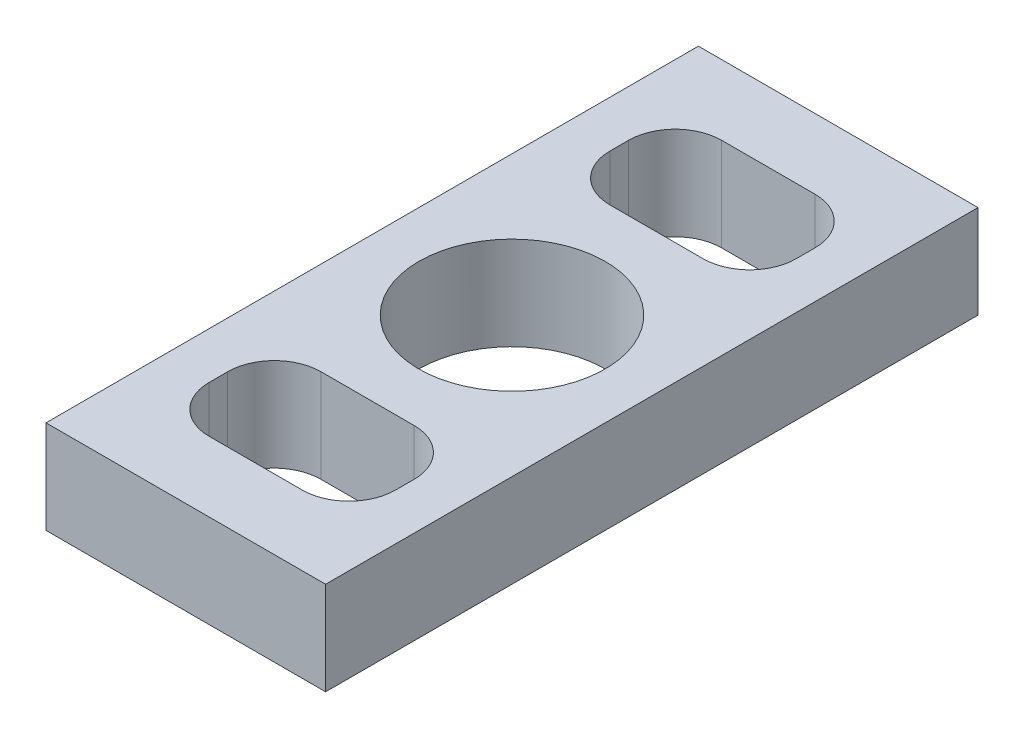
ISO-10303-21;
HEADER;
FILE_DESCRIPTION(('STEP AP214'),'2;1');
FILE_NAME('part.step','',(''),(''),'','','');
FILE_SCHEMA(('AUTOMOTIVE_DESIGN { 1 0 10303 214 1 1 1 1 }'));
ENDSEC;
DATA;
#1=APPLICATION_CONTEXT('core data for automotive mechanical design processes');
#2=APPLICATION_PROTOCOL_DEFINITION('international standard','automotive_design',2000,#1);
#3=PRODUCT_CONTEXT('',#1,'mechanical');
#4=PRODUCT('Part','Part','',(#3));
#5=PRODUCT_RELATED_PRODUCT_CATEGORY('part','',(#4));
#6=PRODUCT_DEFINITION_FORMATION('','',#4);
#7=PRODUCT_DEFINITION_CONTEXT('part definition',#1,'design');
#8=PRODUCT_DEFINITION('design','',#6,#7);
#9=PRODUCT_DEFINITION_SHAPE('','',#8);
#10=(LENGTH_UNIT() NAMED_UNIT(*) SI_UNIT(.MILLI.,.METRE.));
#11=(NAMED_UNIT(*) PLANE_ANGLE_UNIT() SI_UNIT($,.RADIAN.));
#12=(NAMED_UNIT(*) SI_UNIT($,.STERADIAN.) SOLID_ANGLE_UNIT());
#13=UNCERTAINTY_MEASURE_WITH_UNIT(LENGTH_MEASURE(1.E-05),#10,'distance_accuracy_value','');
#14=(GEOMETRIC_REPRESENTATION_CONTEXT(3) GLOBAL_UNCERTAINTY_ASSIGNED_CONTEXT((#13)) GLOBAL_UNIT_ASSIGNED_CONTEXT((#10,
#11,#12)) REPRESENTATION_CONTEXT('',''));
#15=CARTESIAN_POINT('',(0.,0.,0.));
#16=DIRECTION('',(0.,0.,1.));
#17=DIRECTION('',(1.,0.,0.));
#18=AXIS2_PLACEMENT_3D('',#15,#16,#17);
#19=CARTESIAN_POINT('',(-24.7431034482759,6.13103448275861,88.9));
#20=DIRECTION('',(1.,0.,0.));
#21=DIRECTION('',(0.,0.,-1.));
#22=AXIS2_PLACEMENT_3D('',#19,#20,#21);
#23=PLANE('',#22);
#24=DIRECTION('',(0.,-1.,0.));
#25=VECTOR('',#24,1.);
#26=CARTESIAN_POINT('',(-24.7431034482759,6.13103448275861,0.));
#27=LINE('',#26,#25);
#28=CARTESIAN_POINT('',(-24.7431034482759,6.13103448275861,0.));
#29=VERTEX_POINT('',#28);
#30=CARTESIAN_POINT('',(-24.7431034482759,-6.56896551724139,0.));
#31=VERTEX_POINT('',#30);
#32=EDGE_CURVE('E201',#29,#31,#27,.T.);
#33=ORIENTED_EDGE('',*,*,#32,.T.);
#34=DIRECTION('',(0.,0.,-1.));
#35=VECTOR('',#34,1.);
#36=CARTESIAN_POINT('',(-24.7431034482759,-6.56896551724139,88.9));
#37=LINE('',#36,#35);
#38=CARTESIAN_POINT('',(-24.7431034482759,-6.56896551724139,88.9));
#39=VERTEX_POINT('',#38);
#40=EDGE_CURVE('E180',#39,#31,#37,.T.);
#41=ORIENTED_EDGE('',*,*,#40,.F.);
#42=DIRECTION('',(0.,-1.,0.));
#43=VECTOR('',#42,1.);
#44=CARTESIAN_POINT('',(-24.7431034482759,6.13103448275861,88.9));
#45=LINE('',#44,#43);
#46=CARTESIAN_POINT('',(-24.7431034482759,6.13103448275861,88.9));
#47=VERTEX_POINT('',#46);
#48=EDGE_CURVE('E188',#47,#39,#45,.T.);
#49=ORIENTED_EDGE('',*,*,#48,.F.);
#50=DIRECTION('',(0.,0.,-1.));
#51=VECTOR('',#50,1.);
#52=CARTESIAN_POINT('',(-24.7431034482759,6.13103448275861,88.9));
#53=LINE('',#52,#51);
#54=EDGE_CURVE('E368',#47,#29,#53,.T.);
#55=ORIENTED_EDGE('',*,*,#54,.T.);
#56=EDGE_LOOP('',(#33,#41,#49,#55));
#57=FACE_BOUND('',#56,.T.);
#58=ADVANCED_FACE('F38',(#57),#23,.F.);
#59=CARTESIAN_POINT('',(-24.7431034482759,-6.56896551724139,88.9));
#60=DIRECTION('',(0.,1.,0.));
#61=DIRECTION('',(0.,0.,1.));
#62=AXIS2_PLACEMENT_3D('',#59,#60,#61);
#63=PLANE('',#62);
#64=DIRECTION('',(0.,0.,-1.));
#65=VECTOR('',#64,1.);
#66=CARTESIAN_POINT('',(7.00689655172414,-6.56896551724139,9.525));
#67=LINE('',#66,#65);
#68=CARTESIAN_POINT('',(7.00689655172414,-6.56896551724139,18.415));
#69=VERTEX_POINT('',#68);
#70=CARTESIAN_POINT('',(7.00689655172414,-6.56896551724139,15.875));
#71=VERTEX_POINT('',#70);
#72=EDGE_CURVE('E598',#69,#71,#67,.T.);
#73=ORIENTED_EDGE('',*,*,#72,.T.);
#74=CARTESIAN_POINT('',(0.656896551724143,-6.56896551724139,15.875));
#75=DIRECTION('',(0.,1.,0.));
#76=DIRECTION('',(0.,0.,1.));
#77=AXIS2_PLACEMENT_3D('',#74,#75,#76);
#78=CIRCLE('',#77,6.35);
#79=CARTESIAN_POINT('',(0.656896551724143,-6.56896551724139,9.525));
#80=VERTEX_POINT('',#79);
#81=EDGE_CURVE('E285',#71,#80,#78,.T.);
#82=ORIENTED_EDGE('',*,*,#81,.T.);
#83=DIRECTION('',(-1.,0.,0.));
#84=VECTOR('',#83,1.);
#85=CARTESIAN_POINT('',(-18.3931034482759,-6.56896551724139,9.525));
#86=LINE('',#85,#84);
#87=CARTESIAN_POINT('',(-12.0431034482759,-6.56896551724139,9.525));
#88=VERTEX_POINT('',#87);
#89=EDGE_CURVE('E360',#80,#88,#86,.T.);
#90=ORIENTED_EDGE('',*,*,#89,.T.);
#91=CARTESIAN_POINT('',(-12.0431034482759,-6.56896551724139,15.875));
#92=DIRECTION('',(0.,1.,0.));
#93=DIRECTION('',(0.,0.,1.));
#94=AXIS2_PLACEMENT_3D('',#91,#92,#93);
#95=CIRCLE('',#94,6.35);
#96=CARTESIAN_POINT('',(-18.3931034482759,-6.56896551724139,15.875));
#97=VERTEX_POINT('',#96);
#98=EDGE_CURVE('E279',#88,#97,#95,.T.);
#99=ORIENTED_EDGE('',*,*,#98,.T.);
#100=DIRECTION('',(0.,0.,1.));
#101=VECTOR('',#100,1.);
#102=CARTESIAN_POINT('',(-18.3931034482759,-6.56896551724139,9.525));
#103=LINE('',#102,#101);
#104=CARTESIAN_POINT('',(-18.3931034482759,-6.56896551724139,18.415));
#105=VERTEX_POINT('',#104);
#106=EDGE_CURVE('E610',#97,#105,#103,.T.);
#107=ORIENTED_EDGE('',*,*,#106,.T.);
#108=CARTESIAN_POINT('',(-12.0431034482759,-6.56896551724139,18.415));
#109=DIRECTION('',(0.,1.,0.));
#110=DIRECTION('',(0.,0.,1.));
#111=AXIS2_PLACEMENT_3D('',#108,#109,#110);
#112=CIRCLE('',#111,6.35);
#113=CARTESIAN_POINT('',(-12.0431034482759,-6.56896551724139,24.765));
#114=VERTEX_POINT('',#113);
#115=EDGE_CURVE('E273',#105,#114,#112,.T.);
#116=ORIENTED_EDGE('',*,*,#115,.T.);
#117=DIRECTION('',(1.,0.,0.));
#118=VECTOR('',#117,1.);
#119=CARTESIAN_POINT('',(-18.3931034482759,-6.56896551724139,24.765));
#120=LINE('',#119,#118);
#121=CARTESIAN_POINT('',(0.656896551724146,-6.56896551724139,24.765));
#122=VERTEX_POINT('',#121);
#123=EDGE_CURVE('E600',#114,#122,#120,.T.);
#124=ORIENTED_EDGE('',*,*,#123,.T.);
#125=CARTESIAN_POINT('',(0.656896551724145,-6.56896551724139,18.415));
#126=DIRECTION('',(0.,1.,0.));
#127=DIRECTION('',(0.,0.,1.));
#128=AXIS2_PLACEMENT_3D('',#125,#126,#127);
#129=CIRCLE('',#128,6.35);
#130=EDGE_CURVE('E267',#122,#69,#129,.T.);
#131=ORIENTED_EDGE('',*,*,#130,.T.);
#132=EDGE_LOOP('',(#73,#82,#90,#99,#107,#116,#124,#131));
#133=FACE_BOUND('',#132,.T.);
#134=DIRECTION('',(0.,0.,-1.));
#135=VECTOR('',#134,1.);
#136=CARTESIAN_POINT('',(7.00689655172415,-6.56896551724139,79.375));
#137=LINE('',#136,#135);
#138=CARTESIAN_POINT('',(7.00689655172415,-6.56896551724139,73.025));
#139=VERTEX_POINT('',#138);
#140=CARTESIAN_POINT('',(7.00689655172415,-6.56896551724139,70.485));
#141=VERTEX_POINT('',#140);
#142=EDGE_CURVE('E333',#139,#141,#137,.T.);
#143=ORIENTED_EDGE('',*,*,#142,.T.);
#144=CARTESIAN_POINT('',(0.65689655172415,-6.56896551724139,70.485));
#145=DIRECTION('',(0.,1.,0.));
#146=DIRECTION('',(0.,0.,1.));
#147=AXIS2_PLACEMENT_3D('',#144,#145,#146);
#148=CIRCLE('',#147,6.35);
#149=CARTESIAN_POINT('',(0.65689655172415,-6.56896551724139,64.135));
#150=VERTEX_POINT('',#149);
#151=EDGE_CURVE('E291',#141,#150,#148,.T.);
#152=ORIENTED_EDGE('',*,*,#151,.T.);
#153=DIRECTION('',(-1.,0.,0.));
#154=VECTOR('',#153,1.);
#155=CARTESIAN_POINT('',(-18.3931034482759,-6.56896551724139,64.135));
#156=LINE('',#155,#154);
#157=CARTESIAN_POINT('',(-12.0431034482759,-6.56896551724139,64.135));
#158=VERTEX_POINT('',#157);
#159=EDGE_CURVE('E342',#150,#158,#156,.T.);
#160=ORIENTED_EDGE('',*,*,#159,.T.);
#161=CARTESIAN_POINT('',(-12.0431034482759,-6.56896551724139,70.485));
#162=DIRECTION('',(0.,1.,0.));
#163=DIRECTION('',(0.,0.,1.));
#164=AXIS2_PLACEMENT_3D('',#161,#162,#163);
#165=CIRCLE('',#164,6.35);
#166=CARTESIAN_POINT('',(-18.3931034482759,-6.56896551724139,70.485));
#167=VERTEX_POINT('',#166);
#168=EDGE_CURVE('E11',#158,#167,#165,.T.);
#169=ORIENTED_EDGE('',*,*,#168,.T.);
#170=DIRECTION('',(0.,0.,1.));
#171=VECTOR('',#170,1.);
#172=CARTESIAN_POINT('',(-18.3931034482759,-6.56896551724139,79.375));
#173=LINE('',#172,#171);
#174=CARTESIAN_POINT('',(-18.3931034482759,-6.56896551724139,73.025));
#175=VERTEX_POINT('',#174);
#176=EDGE_CURVE('E323',#167,#175,#173,.T.);
#177=ORIENTED_EDGE('',*,*,#176,.T.);
#178=CARTESIAN_POINT('',(-12.0431034482759,-6.56896551724139,73.025));
#179=DIRECTION('',(0.,1.,0.));
#180=DIRECTION('',(0.,0.,1.));
#181=AXIS2_PLACEMENT_3D('',#178,#179,#180);
#182=CIRCLE('',#181,6.35);
#183=CARTESIAN_POINT('',(-12.0431034482759,-6.56896551724139,79.375));
#184=VERTEX_POINT('',#183);
#185=EDGE_CURVE('E303',#175,#184,#182,.T.);
#186=ORIENTED_EDGE('',*,*,#185,.T.);
#187=DIRECTION('',(1.,0.,0.));
#188=VECTOR('',#187,1.);
#189=CARTESIAN_POINT('',(-18.3931034482759,-6.56896551724139,79.375));
#190=LINE('',#189,#188);
#191=CARTESIAN_POINT('',(0.656896551724153,-6.56896551724139,79.375));
#192=VERTEX_POINT('',#191);
#193=EDGE_CURVE('E329',#184,#192,#190,.T.);
#194=ORIENTED_EDGE('',*,*,#193,.T.);
#195=CARTESIAN_POINT('',(0.656896551724152,-6.56896551724139,73.025));
#196=DIRECTION('',(0.,1.,0.));
#197=DIRECTION('',(0.,0.,1.));
#198=AXIS2_PLACEMENT_3D('',#195,#196,#197);
#199=CIRCLE('',#198,6.35);
#200=EDGE_CURVE('E297',#192,#139,#199,.T.);
#201=ORIENTED_EDGE('',*,*,#200,.T.);
#202=EDGE_LOOP('',(#143,#152,#160,#169,#177,#186,#194,#201));
#203=FACE_BOUND('',#202,.T.);
#204=CARTESIAN_POINT('',(-5.69310344827585,-6.56896551724138,44.45));
#205=DIRECTION('',(0.,1.,0.));
#206=DIRECTION('',(0.,0.,1.));
#207=AXIS2_PLACEMENT_3D('',#204,#205,#206);
#208=CIRCLE('',#207,12.7);
#209=CARTESIAN_POINT('',(-5.69310344827585,-6.56896551724138,57.15));
#210=VERTEX_POINT('',#209);
#211=EDGE_CURVE('E359',#210,#210,#208,.T.);
#212=ORIENTED_EDGE('',*,*,#211,.T.);
#213=EDGE_LOOP('',(#212));
#214=FACE_BOUND('',#213,.T.);
#215=DIRECTION('',(1.,0.,0.));
#216=VECTOR('',#215,1.);
#217=CARTESIAN_POINT('',(-24.7431034482759,-6.56896551724139,0.));
#218=LINE('',#217,#216);
#219=CARTESIAN_POINT('',(13.3568965517241,-6.56896551724139,0.));
#220=VERTEX_POINT('',#219);
#221=EDGE_CURVE('E371',#31,#220,#218,.T.);
#222=ORIENTED_EDGE('',*,*,#221,.T.);
#223=DIRECTION('',(0.,0.,-1.));
#224=VECTOR('',#223,1.);
#225=CARTESIAN_POINT('',(13.3568965517241,-6.56896551724139,88.9));
#226=LINE('',#225,#224);
#227=CARTESIAN_POINT('',(13.3568965517241,-6.56896551724139,88.9));
#228=VERTEX_POINT('',#227);
#229=EDGE_CURVE('E183',#228,#220,#226,.T.);
#230=ORIENTED_EDGE('',*,*,#229,.F.);
#231=DIRECTION('',(1.,0.,0.));
#232=VECTOR('',#231,1.);
#233=CARTESIAN_POINT('',(-24.7431034482759,-6.56896551724139,88.9));
#234=LINE('',#233,#232);
#235=EDGE_CURVE('E176',#39,#228,#234,.T.);
#236=ORIENTED_EDGE('',*,*,#235,.F.);
#237=ORIENTED_EDGE('',*,*,#40,.T.);
#238=EDGE_LOOP('',(#222,#230,#236,#237));
#239=FACE_BOUND('',#238,.T.);
#240=ADVANCED_FACE('F178',(#133,#203,#214,#239),#63,.F.);
#241=CARTESIAN_POINT('',(13.3568965517241,6.13103448275861,88.9));
#242=DIRECTION('',(-1.,0.,0.));
#243=DIRECTION('',(0.,0.,1.));
#244=AXIS2_PLACEMENT_3D('',#241,#242,#243);
#245=PLANE('',#244);
#246=DIRECTION('',(0.,1.,0.));
#247=VECTOR('',#246,1.);
#248=CARTESIAN_POINT('',(13.3568965517241,6.13103448275861,0.));
#249=LINE('',#248,#247);
#250=CARTESIAN_POINT('',(13.3568965517241,6.13103448275861,0.));
#251=VERTEX_POINT('',#250);
#252=EDGE_CURVE('E374',#220,#251,#249,.T.);
#253=ORIENTED_EDGE('',*,*,#252,.T.);
#254=DIRECTION('',(0.,0.,-1.));
#255=VECTOR('',#254,1.);
#256=CARTESIAN_POINT('',(13.3568965517241,6.13103448275861,88.9));
#257=LINE('',#256,#255);
#258=CARTESIAN_POINT('',(13.3568965517241,6.13103448275861,88.9));
#259=VERTEX_POINT('',#258);
#260=EDGE_CURVE('E209',#259,#251,#257,.T.);
#261=ORIENTED_EDGE('',*,*,#260,.F.);
#262=DIRECTION('',(0.,1.,0.));
#263=VECTOR('',#262,1.);
#264=CARTESIAN_POINT('',(13.3568965517241,6.13103448275861,88.9));
#265=LINE('',#264,#263);
#266=EDGE_CURVE('E187',#228,#259,#265,.T.);
#267=ORIENTED_EDGE('',*,*,#266,.F.);
#268=ORIENTED_EDGE('',*,*,#229,.T.);
#269=EDGE_LOOP('',(#253,#261,#267,#268));
#270=FACE_BOUND('',#269,.T.);
#271=ADVANCED_FACE('F389',(#270),#245,.F.);
#272=CARTESIAN_POINT('',(-24.7431034482759,6.13103448275861,88.9));
#273=DIRECTION('',(0.,-1.,0.));
#274=DIRECTION('',(1.,0.,0.));
#275=AXIS2_PLACEMENT_3D('',#272,#273,#274);
#276=PLANE('',#275);
#277=DIRECTION('',(1.,0.,0.));
#278=VECTOR('',#277,1.);
#279=CARTESIAN_POINT('',(-18.3931034482759,6.13103448275861,24.765));
#280=LINE('',#279,#278);
#281=CARTESIAN_POINT('',(-12.0431034482759,6.13103448275861,24.765));
#282=VERTEX_POINT('',#281);
#283=CARTESIAN_POINT('',(0.656896551724146,6.13103448275861,24.765));
#284=VERTEX_POINT('',#283);
#285=EDGE_CURVE('E586',#282,#284,#280,.T.);
#286=ORIENTED_EDGE('',*,*,#285,.F.);
#287=CARTESIAN_POINT('',(-12.0431034482759,6.13103448275861,18.415));
#288=DIRECTION('',(0.,-1.,0.));
#289=DIRECTION('',(1.,0.,0.));
#290=AXIS2_PLACEMENT_3D('',#287,#288,#289);
#291=CIRCLE('',#290,6.35);
#292=CARTESIAN_POINT('',(-18.3931034482759,6.13103448275861,18.415));
#293=VERTEX_POINT('',#292);
#294=EDGE_CURVE('E270',#282,#293,#291,.T.);
#295=ORIENTED_EDGE('',*,*,#294,.T.);
#296=DIRECTION('',(0.,0.,1.));
#297=VECTOR('',#296,1.);
#298=CARTESIAN_POINT('',(-18.3931034482759,6.13103448275861,9.525));
#299=LINE('',#298,#297);
#300=CARTESIAN_POINT('',(-18.3931034482759,6.13103448275861,15.875));
#301=VERTEX_POINT('',#300);
#302=EDGE_CURVE('E345',#301,#293,#299,.T.);
#303=ORIENTED_EDGE('',*,*,#302,.F.);
#304=CARTESIAN_POINT('',(-12.0431034482759,6.13103448275861,15.875));
#305=DIRECTION('',(0.,-1.,0.));
#306=DIRECTION('',(1.,0.,0.));
#307=AXIS2_PLACEMENT_3D('',#304,#305,#306);
#308=CIRCLE('',#307,6.35);
#309=CARTESIAN_POINT('',(-12.0431034482759,6.13103448275861,9.525));
#310=VERTEX_POINT('',#309);
#311=EDGE_CURVE('E276',#301,#310,#308,.T.);
#312=ORIENTED_EDGE('',*,*,#311,.T.);
#313=DIRECTION('',(-1.,0.,0.));
#314=VECTOR('',#313,1.);
#315=CARTESIAN_POINT('',(-18.3931034482759,6.13103448275861,9.525));
#316=LINE('',#315,#314);
#317=CARTESIAN_POINT('',(0.656896551724143,6.13103448275861,9.525));
#318=VERTEX_POINT('',#317);
#319=EDGE_CURVE('E336',#318,#310,#316,.T.);
#320=ORIENTED_EDGE('',*,*,#319,.F.);
#321=CARTESIAN_POINT('',(0.656896551724143,6.13103448275861,15.875));
#322=DIRECTION('',(0.,-1.,0.));
#323=DIRECTION('',(1.,0.,0.));
#324=AXIS2_PLACEMENT_3D('',#321,#322,#323);
#325=CIRCLE('',#324,6.35);
#326=CARTESIAN_POINT('',(7.00689655172414,6.13103448275861,15.875));
#327=VERTEX_POINT('',#326);
#328=EDGE_CURVE('E282',#318,#327,#325,.T.);
#329=ORIENTED_EDGE('',*,*,#328,.T.);
#330=DIRECTION('',(0.,0.,-1.));
#331=VECTOR('',#330,1.);
#332=CARTESIAN_POINT('',(7.00689655172414,6.13103448275861,9.525));
#333=LINE('',#332,#331);
#334=CARTESIAN_POINT('',(7.00689655172414,6.13103448275861,18.415));
#335=VERTEX_POINT('',#334);
#336=EDGE_CURVE('E592',#335,#327,#333,.T.);
#337=ORIENTED_EDGE('',*,*,#336,.F.);
#338=CARTESIAN_POINT('',(0.656896551724146,6.13103448275861,18.415));
#339=DIRECTION('',(0.,-1.,0.));
#340=DIRECTION('',(1.,0.,0.));
#341=AXIS2_PLACEMENT_3D('',#338,#339,#340);
#342=CIRCLE('',#341,6.35);
#343=EDGE_CURVE('E264',#335,#284,#342,.T.);
#344=ORIENTED_EDGE('',*,*,#343,.T.);
#345=EDGE_LOOP('',(#286,#295,#303,#312,#320,#329,#337,#344));
#346=FACE_BOUND('',#345,.T.);
#347=DIRECTION('',(1.,0.,0.));
#348=VECTOR('',#347,1.);
#349=CARTESIAN_POINT('',(-18.3931034482759,6.13103448275861,79.375));
#350=LINE('',#349,#348);
#351=CARTESIAN_POINT('',(-12.0431034482759,6.13103448275861,79.375));
#352=VERTEX_POINT('',#351);
#353=CARTESIAN_POINT('',(0.656896551724153,6.13103448275861,79.375));
#354=VERTEX_POINT('',#353);
#355=EDGE_CURVE('E348',#352,#354,#350,.T.);
#356=ORIENTED_EDGE('',*,*,#355,.F.);
#357=CARTESIAN_POINT('',(-12.0431034482759,6.13103448275861,73.025));
#358=DIRECTION('',(0.,-1.,0.));
#359=DIRECTION('',(1.,0.,0.));
#360=AXIS2_PLACEMENT_3D('',#357,#358,#359);
#361=CIRCLE('',#360,6.35);
#362=CARTESIAN_POINT('',(-18.3931034482759,6.13103448275861,73.025));
#363=VERTEX_POINT('',#362);
#364=EDGE_CURVE('E300',#352,#363,#361,.T.);
#365=ORIENTED_EDGE('',*,*,#364,.T.);
#366=DIRECTION('',(0.,0.,1.));
#367=VECTOR('',#366,1.);
#368=CARTESIAN_POINT('',(-18.3931034482759,6.13103448275861,79.375));
#369=LINE('',#368,#367);
#370=CARTESIAN_POINT('',(-18.3931034482759,6.13103448275861,70.485));
#371=VERTEX_POINT('',#370);
#372=EDGE_CURVE('E314',#371,#363,#369,.T.);
#373=ORIENTED_EDGE('',*,*,#372,.F.);
#374=CARTESIAN_POINT('',(-12.0431034482759,6.13103448275861,70.485));
#375=DIRECTION('',(0.,-1.,0.));
#376=DIRECTION('',(1.,0.,0.));
#377=AXIS2_PLACEMENT_3D('',#374,#375,#376);
#378=CIRCLE('',#377,6.35);
#379=CARTESIAN_POINT('',(-12.0431034482759,6.13103448275861,64.135));
#380=VERTEX_POINT('',#379);
#381=EDGE_CURVE('E47',#371,#380,#378,.T.);
#382=ORIENTED_EDGE('',*,*,#381,.T.);
#383=DIRECTION('',(-1.,0.,0.));
#384=VECTOR('',#383,1.);
#385=CARTESIAN_POINT('',(-18.3931034482759,6.13103448275861,64.135));
#386=LINE('',#385,#384);
#387=CARTESIAN_POINT('',(0.65689655172415,6.13103448275861,64.135));
#388=VERTEX_POINT('',#387);
#389=EDGE_CURVE('E313',#388,#380,#386,.T.);
#390=ORIENTED_EDGE('',*,*,#389,.F.);
#391=CARTESIAN_POINT('',(0.65689655172415,6.13103448275861,70.485));
#392=DIRECTION('',(0.,-1.,0.));
#393=DIRECTION('',(1.,0.,0.));
#394=AXIS2_PLACEMENT_3D('',#391,#392,#393);
#395=CIRCLE('',#394,6.35);
#396=CARTESIAN_POINT('',(7.00689655172415,6.13103448275861,70.485));
#397=VERTEX_POINT('',#396);
#398=EDGE_CURVE('E288',#388,#397,#395,.T.);
#399=ORIENTED_EDGE('',*,*,#398,.T.);
#400=DIRECTION('',(0.,0.,-1.));
#401=VECTOR('',#400,1.);
#402=CARTESIAN_POINT('',(7.00689655172415,6.13103448275861,79.375));
#403=LINE('',#402,#401);
#404=CARTESIAN_POINT('',(7.00689655172415,6.13103448275861,73.025));
#405=VERTEX_POINT('',#404);
#406=EDGE_CURVE('E324',#405,#397,#403,.T.);
#407=ORIENTED_EDGE('',*,*,#406,.F.);
#408=CARTESIAN_POINT('',(0.656896551724152,6.13103448275861,73.025));
#409=DIRECTION('',(0.,-1.,0.));
#410=DIRECTION('',(1.,0.,0.));
#411=AXIS2_PLACEMENT_3D('',#408,#409,#410);
#412=CIRCLE('',#411,6.35);
#413=EDGE_CURVE('E294',#405,#354,#412,.T.);
#414=ORIENTED_EDGE('',*,*,#413,.T.);
#415=EDGE_LOOP('',(#356,#365,#373,#382,#390,#399,#407,#414));
#416=FACE_BOUND('',#415,.T.);
#417=CARTESIAN_POINT('',(-5.69310344827585,6.13103448275861,44.45));
#418=DIRECTION('',(0.,1.,0.));
#419=DIRECTION('',(-1.,0.,0.));
#420=AXIS2_PLACEMENT_3D('',#417,#418,#419);
#421=CIRCLE('',#420,12.7);
#422=CARTESIAN_POINT('',(-18.3931034482759,6.13103448275861,44.45));
#423=VERTEX_POINT('',#422);
#424=EDGE_CURVE('E355',#423,#423,#421,.T.);
#425=ORIENTED_EDGE('',*,*,#424,.F.);
#426=EDGE_LOOP('',(#425));
#427=FACE_BOUND('',#426,.T.);
#428=DIRECTION('',(-1.,0.,0.));
#429=VECTOR('',#428,1.);
#430=CARTESIAN_POINT('',(-24.7431034482759,6.13103448275861,0.));
#431=LINE('',#430,#429);
#432=EDGE_CURVE('E198',#251,#29,#431,.T.);
#433=ORIENTED_EDGE('',*,*,#432,.T.);
#434=ORIENTED_EDGE('',*,*,#54,.F.);
#435=DIRECTION('',(-1.,0.,0.));
#436=VECTOR('',#435,1.);
#437=CARTESIAN_POINT('',(-24.7431034482759,6.13103448275861,88.9));
#438=LINE('',#437,#436);
#439=EDGE_CURVE('E193',#259,#47,#438,.T.);
#440=ORIENTED_EDGE('',*,*,#439,.F.);
#441=ORIENTED_EDGE('',*,*,#260,.T.);
#442=EDGE_LOOP('',(#433,#434,#440,#441));
#443=FACE_BOUND('',#442,.T.);
#444=ADVANCED_FACE('F311',(#346,#416,#427,#443),#276,.F.);
#445=CARTESIAN_POINT('',(0.,0.,88.9));
#446=DIRECTION('',(0.,0.,1.));
#447=DIRECTION('',(1.,0.,0.));
#448=AXIS2_PLACEMENT_3D('',#445,#446,#447);
#449=PLANE('',#448);
#450=ORIENTED_EDGE('',*,*,#48,.T.);
#451=ORIENTED_EDGE('',*,*,#235,.T.);
#452=ORIENTED_EDGE('',*,*,#266,.T.);
#453=ORIENTED_EDGE('',*,*,#439,.T.);
#454=EDGE_LOOP('',(#450,#451,#452,#453));
#455=FACE_BOUND('',#454,.T.);
#456=ADVANCED_FACE('F191',(#455),#449,.T.);
#457=CARTESIAN_POINT('',(0.,0.,0.));
#458=DIRECTION('',(0.,0.,1.));
#459=DIRECTION('',(1.,0.,0.));
#460=AXIS2_PLACEMENT_3D('',#457,#458,#459);
#461=PLANE('',#460);
#462=ORIENTED_EDGE('',*,*,#32,.F.);
#463=ORIENTED_EDGE('',*,*,#432,.F.);
#464=ORIENTED_EDGE('',*,*,#252,.F.);
#465=ORIENTED_EDGE('',*,*,#221,.F.);
#466=EDGE_LOOP('',(#462,#463,#464,#465));
#467=FACE_BOUND('',#466,.T.);
#468=ADVANCED_FACE('F388',(#467),#461,.F.);
#469=CARTESIAN_POINT('',(-5.69310344827586,-82.7689655172414,44.45));
#470=DIRECTION('',(0.,1.,0.));
#471=DIRECTION('',(-1.,0.,0.));
#472=AXIS2_PLACEMENT_3D('',#469,#470,#471);
#473=CYLINDRICAL_SURFACE('',#472,12.7);
#474=ORIENTED_EDGE('',*,*,#424,.T.);
#475=EDGE_LOOP('',(#474));
#476=FACE_BOUND('',#475,.T.);
#477=ORIENTED_EDGE('',*,*,#211,.F.);
#478=EDGE_LOOP('',(#477));
#479=FACE_BOUND('',#478,.T.);
#480=ADVANCED_FACE('F462',(#476,#479),#473,.F.);
#481=CARTESIAN_POINT('',(-18.3931034482759,-6.56896551724139,79.375));
#482=DIRECTION('',(-1.,0.,0.));
#483=DIRECTION('',(0.,-1.,0.));
#484=AXIS2_PLACEMENT_3D('',#481,#482,#483);
#485=PLANE('',#484);
#486=ORIENTED_EDGE('',*,*,#372,.T.);
#487=DIRECTION('',(0.,1.,0.));
#488=VECTOR('',#487,1.);
#489=CARTESIAN_POINT('',(-18.3931034482759,-6.56896551724139,73.025));
#490=LINE('',#489,#488);
#491=EDGE_CURVE('E54',#363,#175,#490,.F.);
#492=ORIENTED_EDGE('',*,*,#491,.T.);
#493=ORIENTED_EDGE('',*,*,#176,.F.);
#494=DIRECTION('',(0.,1.,0.));
#495=VECTOR('',#494,1.);
#496=CARTESIAN_POINT('',(-18.3931034482759,6.13103448275861,70.485));
#497=LINE('',#496,#495);
#498=EDGE_CURVE('E258',#167,#371,#497,.T.);
#499=ORIENTED_EDGE('',*,*,#498,.T.);
#500=EDGE_LOOP('',(#486,#492,#493,#499));
#501=FACE_BOUND('',#500,.T.);
#502=ADVANCED_FACE('F326',(#501),#485,.F.);
#503=CARTESIAN_POINT('',(-18.3931034482759,-6.56896551724139,64.135));
#504=DIRECTION('',(0.,0.,-1.));
#505=DIRECTION('',(-1.,0.,0.));
#506=AXIS2_PLACEMENT_3D('',#503,#504,#505);
#507=PLANE('',#506);
#508=ORIENTED_EDGE('',*,*,#159,.F.);
#509=DIRECTION('',(0.,1.,0.));
#510=VECTOR('',#509,1.);
#511=CARTESIAN_POINT('',(0.65689655172415,6.13103448275861,64.135));
#512=LINE('',#511,#510);
#513=EDGE_CURVE('E240',#150,#388,#512,.T.);
#514=ORIENTED_EDGE('',*,*,#513,.T.);
#515=ORIENTED_EDGE('',*,*,#389,.T.);
#516=DIRECTION('',(0.,1.,0.));
#517=VECTOR('',#516,1.);
#518=CARTESIAN_POINT('',(-12.0431034482759,-6.56896551724139,64.135));
#519=LINE('',#518,#517);
#520=EDGE_CURVE('E237',#380,#158,#519,.F.);
#521=ORIENTED_EDGE('',*,*,#520,.T.);
#522=EDGE_LOOP('',(#508,#514,#515,#521));
#523=FACE_BOUND('',#522,.T.);
#524=ADVANCED_FACE('F320',(#523),#507,.F.);
#525=CARTESIAN_POINT('',(7.00689655172415,-6.56896551724139,79.375));
#526=DIRECTION('',(1.,0.,0.));
#527=DIRECTION('',(0.,0.,-1.));
#528=AXIS2_PLACEMENT_3D('',#525,#526,#527);
#529=PLANE('',#528);
#530=ORIENTED_EDGE('',*,*,#406,.T.);
#531=DIRECTION('',(0.,1.,0.));
#532=VECTOR('',#531,1.);
#533=CARTESIAN_POINT('',(7.00689655172415,-6.56896551724139,70.485));
#534=LINE('',#533,#532);
#535=EDGE_CURVE('E248',#397,#141,#534,.F.);
#536=ORIENTED_EDGE('',*,*,#535,.T.);
#537=ORIENTED_EDGE('',*,*,#142,.F.);
#538=DIRECTION('',(0.,1.,0.));
#539=VECTOR('',#538,1.);
#540=CARTESIAN_POINT('',(7.00689655172415,6.13103448275861,73.025));
#541=LINE('',#540,#539);
#542=EDGE_CURVE('E244',#139,#405,#541,.T.);
#543=ORIENTED_EDGE('',*,*,#542,.T.);
#544=EDGE_LOOP('',(#530,#536,#537,#543));
#545=FACE_BOUND('',#544,.T.);
#546=ADVANCED_FACE('F446',(#545),#529,.F.);
#547=CARTESIAN_POINT('',(-18.3931034482759,-6.56896551724139,79.375));
#548=DIRECTION('',(0.,0.,1.));
#549=DIRECTION('',(1.,0.,0.));
#550=AXIS2_PLACEMENT_3D('',#547,#548,#549);
#551=PLANE('',#550);
#552=ORIENTED_EDGE('',*,*,#355,.T.);
#553=DIRECTION('',(0.,1.,0.));
#554=VECTOR('',#553,1.);
#555=CARTESIAN_POINT('',(0.656896551724152,-6.56896551724139,79.375));
#556=LINE('',#555,#554);
#557=EDGE_CURVE('E255',#354,#192,#556,.F.);
#558=ORIENTED_EDGE('',*,*,#557,.T.);
#559=ORIENTED_EDGE('',*,*,#193,.F.);
#560=DIRECTION('',(0.,1.,0.));
#561=VECTOR('',#560,1.);
#562=CARTESIAN_POINT('',(-12.0431034482759,6.13103448275861,79.375));
#563=LINE('',#562,#561);
#564=EDGE_CURVE('E251',#184,#352,#563,.T.);
#565=ORIENTED_EDGE('',*,*,#564,.T.);
#566=EDGE_LOOP('',(#552,#558,#559,#565));
#567=FACE_BOUND('',#566,.T.);
#568=ADVANCED_FACE('F440',(#567),#551,.F.);
#569=CARTESIAN_POINT('',(-18.3931034482759,-6.56896551724139,9.525));
#570=DIRECTION('',(-1.,0.,0.));
#571=DIRECTION('',(0.,0.,1.));
#572=AXIS2_PLACEMENT_3D('',#569,#570,#571);
#573=PLANE('',#572);
#574=ORIENTED_EDGE('',*,*,#302,.T.);
#575=DIRECTION('',(0.,1.,0.));
#576=VECTOR('',#575,1.);
#577=CARTESIAN_POINT('',(-18.3931034482759,-6.56896551724139,18.415));
#578=LINE('',#577,#576);
#579=EDGE_CURVE('E227',#293,#105,#578,.F.);
#580=ORIENTED_EDGE('',*,*,#579,.T.);
#581=ORIENTED_EDGE('',*,*,#106,.F.);
#582=DIRECTION('',(0.,1.,0.));
#583=VECTOR('',#582,1.);
#584=CARTESIAN_POINT('',(-18.3931034482759,6.13103448275861,15.875));
#585=LINE('',#584,#583);
#586=EDGE_CURVE('E223',#97,#301,#585,.T.);
#587=ORIENTED_EDGE('',*,*,#586,.T.);
#588=EDGE_LOOP('',(#574,#580,#581,#587));
#589=FACE_BOUND('',#588,.T.);
#590=ADVANCED_FACE('F455',(#589),#573,.F.);
#591=CARTESIAN_POINT('',(-18.3931034482759,-6.56896551724139,9.525));
#592=DIRECTION('',(0.,0.,-1.));
#593=DIRECTION('',(-1.,0.,0.));
#594=AXIS2_PLACEMENT_3D('',#591,#592,#593);
#595=PLANE('',#594);
#596=ORIENTED_EDGE('',*,*,#319,.T.);
#597=DIRECTION('',(0.,1.,0.));
#598=VECTOR('',#597,1.);
#599=CARTESIAN_POINT('',(-12.0431034482759,-6.56896551724139,9.525));
#600=LINE('',#599,#598);
#601=EDGE_CURVE('E234',#310,#88,#600,.F.);
#602=ORIENTED_EDGE('',*,*,#601,.T.);
#603=ORIENTED_EDGE('',*,*,#89,.F.);
#604=DIRECTION('',(0.,1.,0.));
#605=VECTOR('',#604,1.);
#606=CARTESIAN_POINT('',(0.656896551724143,6.13103448275861,9.525));
#607=LINE('',#606,#605);
#608=EDGE_CURVE('E230',#80,#318,#607,.T.);
#609=ORIENTED_EDGE('',*,*,#608,.T.);
#610=EDGE_LOOP('',(#596,#602,#603,#609));
#611=FACE_BOUND('',#610,.T.);
#612=ADVANCED_FACE('F506',(#611),#595,.F.);
#613=CARTESIAN_POINT('',(7.00689655172414,-6.56896551724139,9.525));
#614=DIRECTION('',(1.,0.,0.));
#615=DIRECTION('',(0.,0.,-1.));
#616=AXIS2_PLACEMENT_3D('',#613,#614,#615);
#617=PLANE('',#616);
#618=ORIENTED_EDGE('',*,*,#72,.F.);
#619=DIRECTION('',(0.,1.,0.));
#620=VECTOR('',#619,1.);
#621=CARTESIAN_POINT('',(7.00689655172414,6.13103448275861,18.415));
#622=LINE('',#621,#620);
#623=EDGE_CURVE('E207',#69,#335,#622,.T.);
#624=ORIENTED_EDGE('',*,*,#623,.T.);
#625=ORIENTED_EDGE('',*,*,#336,.T.);
#626=DIRECTION('',(0.,1.,0.));
#627=VECTOR('',#626,1.);
#628=CARTESIAN_POINT('',(7.00689655172414,-6.56896551724139,15.875));
#629=LINE('',#628,#627);
#630=EDGE_CURVE('E203',#327,#71,#629,.F.);
#631=ORIENTED_EDGE('',*,*,#630,.T.);
#632=EDGE_LOOP('',(#618,#624,#625,#631));
#633=FACE_BOUND('',#632,.T.);
#634=ADVANCED_FACE('F515',(#633),#617,.F.);
#635=CARTESIAN_POINT('',(-18.3931034482759,-6.56896551724139,24.765));
#636=DIRECTION('',(0.,0.,1.));
#637=DIRECTION('',(1.,0.,0.));
#638=AXIS2_PLACEMENT_3D('',#635,#636,#637);
#639=PLANE('',#638);
#640=ORIENTED_EDGE('',*,*,#285,.T.);
#641=DIRECTION('',(0.,1.,0.));
#642=VECTOR('',#641,1.);
#643=CARTESIAN_POINT('',(0.656896551724145,-6.56896551724139,24.765));
#644=LINE('',#643,#642);
#645=EDGE_CURVE('E220',#284,#122,#644,.F.);
#646=ORIENTED_EDGE('',*,*,#645,.T.);
#647=ORIENTED_EDGE('',*,*,#123,.F.);
#648=DIRECTION('',(0.,1.,0.));
#649=VECTOR('',#648,1.);
#650=CARTESIAN_POINT('',(-12.0431034482759,6.13103448275861,24.765));
#651=LINE('',#650,#649);
#652=EDGE_CURVE('E216',#114,#282,#651,.T.);
#653=ORIENTED_EDGE('',*,*,#652,.T.);
#654=EDGE_LOOP('',(#640,#646,#647,#653));
#655=FACE_BOUND('',#654,.T.);
#656=ADVANCED_FACE('F409',(#655),#639,.F.);
#657=CARTESIAN_POINT('',(0.656896551724145,-6.56896551724139,18.415));
#658=DIRECTION('',(0.,-1.,0.));
#659=DIRECTION('',(1.,0.,0.));
#660=AXIS2_PLACEMENT_3D('',#657,#658,#659);
#661=CYLINDRICAL_SURFACE('',#660,6.35);
#662=ORIENTED_EDGE('',*,*,#130,.F.);
#663=ORIENTED_EDGE('',*,*,#645,.F.);
#664=ORIENTED_EDGE('',*,*,#343,.F.);
#665=ORIENTED_EDGE('',*,*,#623,.F.);
#666=EDGE_LOOP('',(#662,#663,#664,#665));
#667=FACE_BOUND('',#666,.T.);
#668=ADVANCED_FACE('F405',(#667),#661,.F.);
#669=CARTESIAN_POINT('',(-12.0431034482759,-6.56896551724139,18.415));
#670=DIRECTION('',(0.,-1.,0.));
#671=DIRECTION('',(1.,0.,0.));
#672=AXIS2_PLACEMENT_3D('',#669,#670,#671);
#673=CYLINDRICAL_SURFACE('',#672,6.35);
#674=ORIENTED_EDGE('',*,*,#115,.F.);
#675=ORIENTED_EDGE('',*,*,#579,.F.);
#676=ORIENTED_EDGE('',*,*,#294,.F.);
#677=ORIENTED_EDGE('',*,*,#652,.F.);
#678=EDGE_LOOP('',(#674,#675,#676,#677));
#679=FACE_BOUND('',#678,.T.);
#680=ADVANCED_FACE('F408',(#679),#673,.F.);
#681=CARTESIAN_POINT('',(-12.0431034482759,-6.56896551724139,15.875));
#682=DIRECTION('',(0.,-1.,0.));
#683=DIRECTION('',(1.,0.,0.));
#684=AXIS2_PLACEMENT_3D('',#681,#682,#683);
#685=CYLINDRICAL_SURFACE('',#684,6.35);
#686=ORIENTED_EDGE('',*,*,#98,.F.);
#687=ORIENTED_EDGE('',*,*,#601,.F.);
#688=ORIENTED_EDGE('',*,*,#311,.F.);
#689=ORIENTED_EDGE('',*,*,#586,.F.);
#690=EDGE_LOOP('',(#686,#687,#688,#689));
#691=FACE_BOUND('',#690,.T.);
#692=ADVANCED_FACE('F413',(#691),#685,.F.);
#693=CARTESIAN_POINT('',(0.656896551724143,-6.56896551724139,15.875));
#694=DIRECTION('',(0.,-1.,0.));
#695=DIRECTION('',(1.,0.,0.));
#696=AXIS2_PLACEMENT_3D('',#693,#694,#695);
#697=CYLINDRICAL_SURFACE('',#696,6.35);
#698=ORIENTED_EDGE('',*,*,#81,.F.);
#699=ORIENTED_EDGE('',*,*,#630,.F.);
#700=ORIENTED_EDGE('',*,*,#328,.F.);
#701=ORIENTED_EDGE('',*,*,#608,.F.);
#702=EDGE_LOOP('',(#698,#699,#700,#701));
#703=FACE_BOUND('',#702,.T.);
#704=ADVANCED_FACE('F417',(#703),#697,.F.);
#705=CARTESIAN_POINT('',(0.65689655172415,-6.56896551724139,70.485));
#706=DIRECTION('',(0.,-1.,0.));
#707=DIRECTION('',(1.,0.,0.));
#708=AXIS2_PLACEMENT_3D('',#705,#706,#707);
#709=CYLINDRICAL_SURFACE('',#708,6.35);
#710=ORIENTED_EDGE('',*,*,#151,.F.);
#711=ORIENTED_EDGE('',*,*,#535,.F.);
#712=ORIENTED_EDGE('',*,*,#398,.F.);
#713=ORIENTED_EDGE('',*,*,#513,.F.);
#714=EDGE_LOOP('',(#710,#711,#712,#713));
#715=FACE_BOUND('',#714,.T.);
#716=ADVANCED_FACE('F421',(#715),#709,.F.);
#717=CARTESIAN_POINT('',(0.656896551724152,-6.56896551724139,73.025));
#718=DIRECTION('',(0.,-1.,0.));
#719=DIRECTION('',(1.,0.,0.));
#720=AXIS2_PLACEMENT_3D('',#717,#718,#719);
#721=CYLINDRICAL_SURFACE('',#720,6.35);
#722=ORIENTED_EDGE('',*,*,#200,.F.);
#723=ORIENTED_EDGE('',*,*,#557,.F.);
#724=ORIENTED_EDGE('',*,*,#413,.F.);
#725=ORIENTED_EDGE('',*,*,#542,.F.);
#726=EDGE_LOOP('',(#722,#723,#724,#725));
#727=FACE_BOUND('',#726,.T.);
#728=ADVANCED_FACE('F425',(#727),#721,.F.);
#729=CARTESIAN_POINT('',(-12.0431034482759,-6.56896551724139,73.025));
#730=DIRECTION('',(0.,-1.,0.));
#731=DIRECTION('',(1.,0.,0.));
#732=AXIS2_PLACEMENT_3D('',#729,#730,#731);
#733=CYLINDRICAL_SURFACE('',#732,6.35);
#734=ORIENTED_EDGE('',*,*,#185,.F.);
#735=ORIENTED_EDGE('',*,*,#491,.F.);
#736=ORIENTED_EDGE('',*,*,#364,.F.);
#737=ORIENTED_EDGE('',*,*,#564,.F.);
#738=EDGE_LOOP('',(#734,#735,#736,#737));
#739=FACE_BOUND('',#738,.T.);
#740=ADVANCED_FACE('F428',(#739),#733,.F.);
#741=CARTESIAN_POINT('',(-12.0431034482759,-6.56896551724139,70.485));
#742=DIRECTION('',(0.,-1.,0.));
#743=DIRECTION('',(1.,0.,0.));
#744=AXIS2_PLACEMENT_3D('',#741,#742,#743);
#745=CYLINDRICAL_SURFACE('',#744,6.35);
#746=ORIENTED_EDGE('',*,*,#168,.F.);
#747=ORIENTED_EDGE('',*,*,#520,.F.);
#748=ORIENTED_EDGE('',*,*,#381,.F.);
#749=ORIENTED_EDGE('',*,*,#498,.F.);
#750=EDGE_LOOP('',(#746,#747,#748,#749));
#751=FACE_BOUND('',#750,.T.);
#752=ADVANCED_FACE('F40',(#751),#745,.F.);
#753=CLOSED_SHELL('',(#58,#240,#271,#444,#456,#468,#480,#502,#524,#546,#568,#590,#612,#634,#656,
#668,#680,#692,#704,#716,#728,#740,#752));
#754=MANIFOLD_SOLID_BREP('B2',#753);
#755=ADVANCED_BREP_SHAPE_REPRESENTATION('',(#18,#754),#14);
#756=SHAPE_DEFINITION_REPRESENTATION(#9,#755);
ENDSEC;
END-ISO-10303-21;
